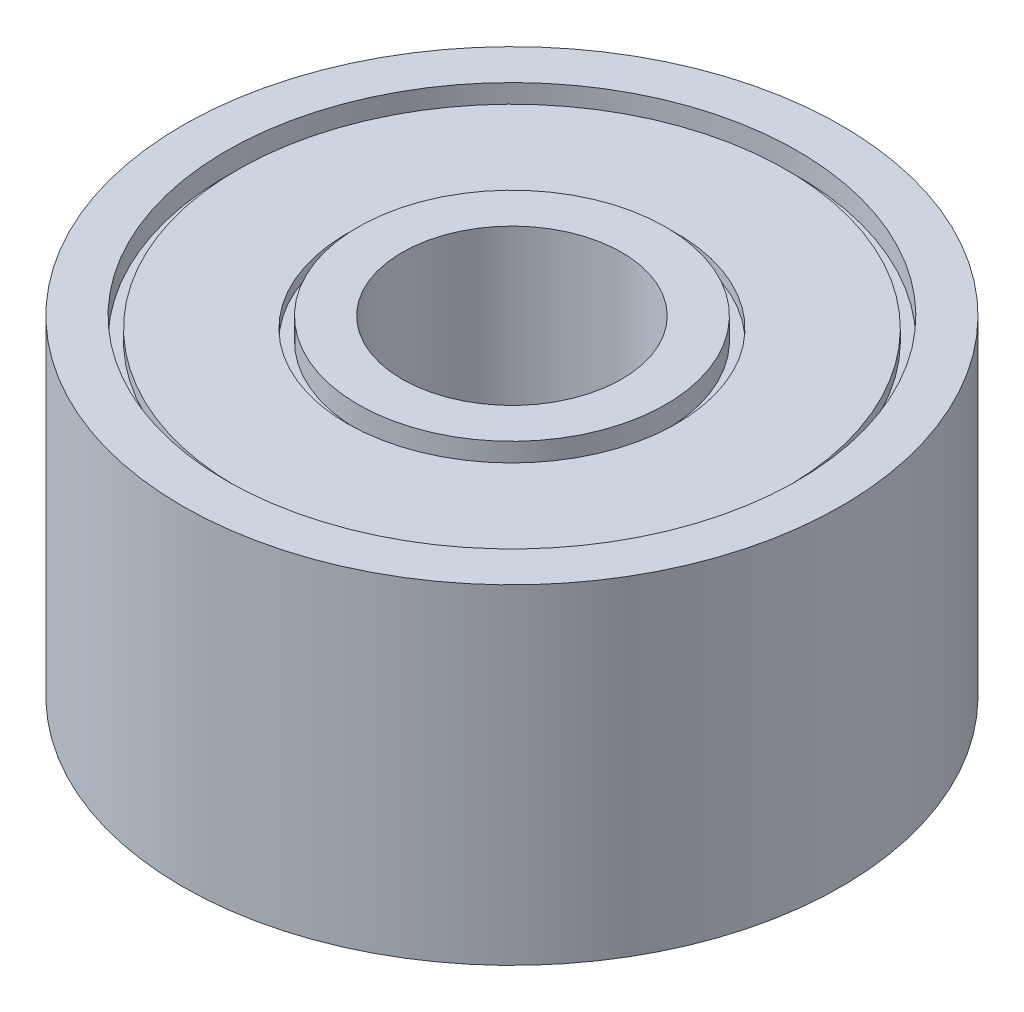
ISO-10303-21;
HEADER;
FILE_DESCRIPTION(('STEP AP214'),'2;1');
FILE_NAME('part.step','',(''),(''),'','','');
FILE_SCHEMA(('AUTOMOTIVE_DESIGN { 1 0 10303 214 1 1 1 1 }'));
ENDSEC;
DATA;
#1=APPLICATION_CONTEXT('core data for automotive mechanical design processes');
#2=APPLICATION_PROTOCOL_DEFINITION('international standard','automotive_design',2000,#1);
#3=PRODUCT_CONTEXT('',#1,'mechanical');
#4=PRODUCT('Part','Part','',(#3));
#5=PRODUCT_RELATED_PRODUCT_CATEGORY('part','',(#4));
#6=PRODUCT_DEFINITION_FORMATION('','',#4);
#7=PRODUCT_DEFINITION_CONTEXT('part definition',#1,'design');
#8=PRODUCT_DEFINITION('design','',#6,#7);
#9=PRODUCT_DEFINITION_SHAPE('','',#8);
#10=(LENGTH_UNIT() NAMED_UNIT(*) SI_UNIT(.MILLI.,.METRE.));
#11=(NAMED_UNIT(*) PLANE_ANGLE_UNIT() SI_UNIT($,.RADIAN.));
#12=(NAMED_UNIT(*) SI_UNIT($,.STERADIAN.) SOLID_ANGLE_UNIT());
#13=UNCERTAINTY_MEASURE_WITH_UNIT(LENGTH_MEASURE(1.E-05),#10,'distance_accuracy_value','');
#14=(GEOMETRIC_REPRESENTATION_CONTEXT(3) GLOBAL_UNCERTAINTY_ASSIGNED_CONTEXT((#13)) GLOBAL_UNIT_ASSIGNED_CONTEXT((#10,
#11,#12)) REPRESENTATION_CONTEXT('',''));
#15=CARTESIAN_POINT('',(0.,0.,0.));
#16=DIRECTION('',(0.,0.,1.));
#17=DIRECTION('',(1.,0.,0.));
#18=AXIS2_PLACEMENT_3D('',#15,#16,#17);
#19=CARTESIAN_POINT('',(0.,0.,0.));
#20=DIRECTION('',(0.,1.,0.));
#21=DIRECTION('',(0.,0.,1.));
#22=AXIS2_PLACEMENT_3D('',#19,#20,#21);
#23=CYLINDRICAL_SURFACE('',#22,3.);
#24=CARTESIAN_POINT('',(0.,-1.5,0.));
#25=DIRECTION('',(0.,1.,0.));
#26=DIRECTION('',(0.,0.,1.));
#27=AXIS2_PLACEMENT_3D('',#24,#25,#26);
#28=CIRCLE('',#27,3.);
#29=CARTESIAN_POINT('',(0.,-1.5,3.));
#30=VERTEX_POINT('',#29);
#31=EDGE_CURVE('E10',#30,#30,#28,.T.);
#32=ORIENTED_EDGE('',*,*,#31,.T.);
#33=EDGE_LOOP('',(#32));
#34=FACE_BOUND('',#33,.T.);
#35=CARTESIAN_POINT('',(0.,1.5,0.));
#36=DIRECTION('',(0.,1.,0.));
#37=DIRECTION('',(0.,0.,1.));
#38=AXIS2_PLACEMENT_3D('',#35,#36,#37);
#39=CIRCLE('',#38,3.);
#40=CARTESIAN_POINT('',(0.,1.5,3.));
#41=VERTEX_POINT('',#40);
#42=EDGE_CURVE('E72',#41,#41,#39,.T.);
#43=ORIENTED_EDGE('',*,*,#42,.F.);
#44=EDGE_LOOP('',(#43));
#45=FACE_BOUND('',#44,.T.);
#46=ADVANCED_FACE('F35',(#34,#45),#23,.T.);
#47=CARTESIAN_POINT('',(0.,-1.5,3.));
#48=DIRECTION('',(0.,-1.,0.));
#49=DIRECTION('',(0.,0.,-1.));
#50=AXIS2_PLACEMENT_3D('',#47,#48,#49);
#51=PLANE('',#50);
#52=CARTESIAN_POINT('',(0.,-1.5,0.));
#53=DIRECTION('',(0.,1.,0.));
#54=DIRECTION('',(0.,0.,1.));
#55=AXIS2_PLACEMENT_3D('',#52,#53,#54);
#56=CIRCLE('',#55,2.6);
#57=CARTESIAN_POINT('',(0.,-1.5,2.6));
#58=VERTEX_POINT('',#57);
#59=EDGE_CURVE('E41',#58,#58,#56,.T.);
#60=ORIENTED_EDGE('',*,*,#59,.T.);
#61=EDGE_LOOP('',(#60));
#62=FACE_BOUND('',#61,.T.);
#63=ORIENTED_EDGE('',*,*,#31,.F.);
#64=EDGE_LOOP('',(#63));
#65=FACE_BOUND('',#64,.T.);
#66=ADVANCED_FACE('F160',(#62,#65),#51,.T.);
#67=CARTESIAN_POINT('',(0.,0.,0.));
#68=DIRECTION('',(0.,1.,0.));
#69=DIRECTION('',(0.,0.,1.));
#70=AXIS2_PLACEMENT_3D('',#67,#68,#69);
#71=CYLINDRICAL_SURFACE('',#70,2.6);
#72=CARTESIAN_POINT('',(0.,-1.3,0.));
#73=DIRECTION('',(0.,1.,0.));
#74=DIRECTION('',(0.,0.,1.));
#75=AXIS2_PLACEMENT_3D('',#72,#73,#74);
#76=CIRCLE('',#75,2.6);
#77=CARTESIAN_POINT('',(0.,-1.3,2.6));
#78=VERTEX_POINT('',#77);
#79=EDGE_CURVE('E45',#78,#78,#76,.T.);
#80=ORIENTED_EDGE('',*,*,#79,.T.);
#81=EDGE_LOOP('',(#80));
#82=FACE_BOUND('',#81,.T.);
#83=ORIENTED_EDGE('',*,*,#59,.F.);
#84=EDGE_LOOP('',(#83));
#85=FACE_BOUND('',#84,.T.);
#86=ADVANCED_FACE('F166',(#82,#85),#71,.F.);
#87=CARTESIAN_POINT('',(0.,-1.3,2.6));
#88=DIRECTION('',(0.,-1.,0.));
#89=DIRECTION('',(0.,0.,-1.));
#90=AXIS2_PLACEMENT_3D('',#87,#88,#89);
#91=PLANE('',#90);
#92=CARTESIAN_POINT('',(0.,-1.3,0.));
#93=DIRECTION('',(0.,1.,0.));
#94=DIRECTION('',(0.,0.,1.));
#95=AXIS2_PLACEMENT_3D('',#92,#93,#94);
#96=CIRCLE('',#95,2.5);
#97=CARTESIAN_POINT('',(0.,-1.3,2.5));
#98=VERTEX_POINT('',#97);
#99=EDGE_CURVE('E49',#98,#98,#96,.T.);
#100=ORIENTED_EDGE('',*,*,#99,.T.);
#101=EDGE_LOOP('',(#100));
#102=FACE_BOUND('',#101,.T.);
#103=ORIENTED_EDGE('',*,*,#79,.F.);
#104=EDGE_LOOP('',(#103));
#105=FACE_BOUND('',#104,.T.);
#106=ADVANCED_FACE('F170',(#102,#105),#91,.T.);
#107=CARTESIAN_POINT('',(0.,0.,0.));
#108=DIRECTION('',(0.,1.,0.));
#109=DIRECTION('',(0.,0.,1.));
#110=AXIS2_PLACEMENT_3D('',#107,#108,#109);
#111=CYLINDRICAL_SURFACE('',#110,2.5);
#112=CARTESIAN_POINT('',(0.,-1.4,0.));
#113=DIRECTION('',(0.,1.,0.));
#114=DIRECTION('',(0.,0.,1.));
#115=AXIS2_PLACEMENT_3D('',#112,#113,#114);
#116=CIRCLE('',#115,2.5);
#117=CARTESIAN_POINT('',(0.,-1.4,2.5));
#118=VERTEX_POINT('',#117);
#119=EDGE_CURVE('E54',#118,#118,#116,.T.);
#120=ORIENTED_EDGE('',*,*,#119,.T.);
#121=EDGE_LOOP('',(#120));
#122=FACE_BOUND('',#121,.T.);
#123=ORIENTED_EDGE('',*,*,#99,.F.);
#124=EDGE_LOOP('',(#123));
#125=FACE_BOUND('',#124,.T.);
#126=ADVANCED_FACE('F177',(#122,#125),#111,.T.);
#127=CARTESIAN_POINT('',(0.,-1.4,2.5));
#128=DIRECTION('',(0.,-1.,0.));
#129=DIRECTION('',(0.,0.,-1.));
#130=AXIS2_PLACEMENT_3D('',#127,#128,#129);
#131=PLANE('',#130);
#132=CARTESIAN_POINT('',(0.,-1.4,0.));
#133=DIRECTION('',(0.,1.,0.));
#134=DIRECTION('',(0.,0.,1.));
#135=AXIS2_PLACEMENT_3D('',#132,#133,#134);
#136=CIRCLE('',#135,1.5);
#137=CARTESIAN_POINT('',(0.,-1.4,1.5));
#138=VERTEX_POINT('',#137);
#139=EDGE_CURVE('E57',#138,#138,#136,.T.);
#140=ORIENTED_EDGE('',*,*,#139,.T.);
#141=EDGE_LOOP('',(#140));
#142=FACE_BOUND('',#141,.T.);
#143=ORIENTED_EDGE('',*,*,#119,.F.);
#144=EDGE_LOOP('',(#143));
#145=FACE_BOUND('',#144,.T.);
#146=ADVANCED_FACE('F181',(#142,#145),#131,.T.);
#147=CARTESIAN_POINT('',(0.,0.,0.));
#148=DIRECTION('',(0.,1.,0.));
#149=DIRECTION('',(0.,0.,1.));
#150=AXIS2_PLACEMENT_3D('',#147,#148,#149);
#151=CYLINDRICAL_SURFACE('',#150,1.5);
#152=CARTESIAN_POINT('',(0.,-1.3,0.));
#153=DIRECTION('',(0.,1.,0.));
#154=DIRECTION('',(0.,0.,1.));
#155=AXIS2_PLACEMENT_3D('',#152,#153,#154);
#156=CIRCLE('',#155,1.5);
#157=CARTESIAN_POINT('',(0.,-1.3,1.5));
#158=VERTEX_POINT('',#157);
#159=EDGE_CURVE('E60',#158,#158,#156,.T.);
#160=ORIENTED_EDGE('',*,*,#159,.T.);
#161=EDGE_LOOP('',(#160));
#162=FACE_BOUND('',#161,.T.);
#163=ORIENTED_EDGE('',*,*,#139,.F.);
#164=EDGE_LOOP('',(#163));
#165=FACE_BOUND('',#164,.T.);
#166=ADVANCED_FACE('F185',(#162,#165),#151,.F.);
#167=CARTESIAN_POINT('',(0.,-1.3,1.5));
#168=DIRECTION('',(0.,-1.,0.));
#169=DIRECTION('',(0.,0.,-1.));
#170=AXIS2_PLACEMENT_3D('',#167,#168,#169);
#171=PLANE('',#170);
#172=CARTESIAN_POINT('',(0.,-1.3,0.));
#173=DIRECTION('',(0.,1.,0.));
#174=DIRECTION('',(0.,0.,1.));
#175=AXIS2_PLACEMENT_3D('',#172,#173,#174);
#176=CIRCLE('',#175,1.4);
#177=CARTESIAN_POINT('',(0.,-1.3,1.4));
#178=VERTEX_POINT('',#177);
#179=EDGE_CURVE('E63',#178,#178,#176,.T.);
#180=ORIENTED_EDGE('',*,*,#179,.T.);
#181=EDGE_LOOP('',(#180));
#182=FACE_BOUND('',#181,.T.);
#183=ORIENTED_EDGE('',*,*,#159,.F.);
#184=EDGE_LOOP('',(#183));
#185=FACE_BOUND('',#184,.T.);
#186=ADVANCED_FACE('F189',(#182,#185),#171,.T.);
#187=CARTESIAN_POINT('',(0.,0.,0.));
#188=DIRECTION('',(0.,1.,0.));
#189=DIRECTION('',(0.,0.,1.));
#190=AXIS2_PLACEMENT_3D('',#187,#188,#189);
#191=CYLINDRICAL_SURFACE('',#190,1.4);
#192=CARTESIAN_POINT('',(0.,-1.5,0.));
#193=DIRECTION('',(0.,1.,0.));
#194=DIRECTION('',(0.,0.,1.));
#195=AXIS2_PLACEMENT_3D('',#192,#193,#194);
#196=CIRCLE('',#195,1.4);
#197=CARTESIAN_POINT('',(0.,-1.5,1.4));
#198=VERTEX_POINT('',#197);
#199=EDGE_CURVE('E66',#198,#198,#196,.T.);
#200=ORIENTED_EDGE('',*,*,#199,.T.);
#201=EDGE_LOOP('',(#200));
#202=FACE_BOUND('',#201,.T.);
#203=ORIENTED_EDGE('',*,*,#179,.F.);
#204=EDGE_LOOP('',(#203));
#205=FACE_BOUND('',#204,.T.);
#206=ADVANCED_FACE('F193',(#202,#205),#191,.T.);
#207=CARTESIAN_POINT('',(0.,-1.5,1.4));
#208=DIRECTION('',(0.,-1.,0.));
#209=DIRECTION('',(0.,0.,-1.));
#210=AXIS2_PLACEMENT_3D('',#207,#208,#209);
#211=PLANE('',#210);
#212=CARTESIAN_POINT('',(0.,-1.5,0.));
#213=DIRECTION('',(0.,1.,0.));
#214=DIRECTION('',(0.,0.,1.));
#215=AXIS2_PLACEMENT_3D('',#212,#213,#214);
#216=CIRCLE('',#215,1.);
#217=CARTESIAN_POINT('',(0.,-1.5,1.));
#218=VERTEX_POINT('',#217);
#219=EDGE_CURVE('E69',#218,#218,#216,.T.);
#220=ORIENTED_EDGE('',*,*,#219,.T.);
#221=EDGE_LOOP('',(#220));
#222=FACE_BOUND('',#221,.T.);
#223=ORIENTED_EDGE('',*,*,#199,.F.);
#224=EDGE_LOOP('',(#223));
#225=FACE_BOUND('',#224,.T.);
#226=ADVANCED_FACE('F197',(#222,#225),#211,.T.);
#227=CARTESIAN_POINT('',(0.,0.,0.));
#228=DIRECTION('',(0.,1.,0.));
#229=DIRECTION('',(0.,0.,1.));
#230=AXIS2_PLACEMENT_3D('',#227,#228,#229);
#231=CYLINDRICAL_SURFACE('',#230,1.);
#232=ORIENTED_EDGE('',*,*,#219,.F.);
#233=EDGE_LOOP('',(#232));
#234=FACE_BOUND('',#233,.T.);
#235=CARTESIAN_POINT('',(0.,1.5,0.));
#236=DIRECTION('',(0.,1.,0.));
#237=DIRECTION('',(0.,0.,1.));
#238=AXIS2_PLACEMENT_3D('',#235,#236,#237);
#239=CIRCLE('',#238,1.);
#240=CARTESIAN_POINT('',(0.,1.5,1.));
#241=VERTEX_POINT('',#240);
#242=EDGE_CURVE('E99',#241,#241,#239,.T.);
#243=ORIENTED_EDGE('',*,*,#242,.T.);
#244=EDGE_LOOP('',(#243));
#245=FACE_BOUND('',#244,.T.);
#246=ADVANCED_FACE('F103',(#234,#245),#231,.F.);
#247=CARTESIAN_POINT('',(0.,1.5,3.));
#248=DIRECTION('',(0.,1.,0.));
#249=DIRECTION('',(0.,0.,-1.));
#250=AXIS2_PLACEMENT_3D('',#247,#248,#249);
#251=PLANE('',#250);
#252=CARTESIAN_POINT('',(0.,1.5,0.));
#253=DIRECTION('',(0.,1.,0.));
#254=DIRECTION('',(0.,0.,1.));
#255=AXIS2_PLACEMENT_3D('',#252,#253,#254);
#256=CIRCLE('',#255,2.6);
#257=CARTESIAN_POINT('',(0.,1.5,2.6));
#258=VERTEX_POINT('',#257);
#259=EDGE_CURVE('E75',#258,#258,#256,.T.);
#260=ORIENTED_EDGE('',*,*,#259,.F.);
#261=EDGE_LOOP('',(#260));
#262=FACE_BOUND('',#261,.T.);
#263=ORIENTED_EDGE('',*,*,#42,.T.);
#264=EDGE_LOOP('',(#263));
#265=FACE_BOUND('',#264,.T.);
#266=ADVANCED_FACE('F150',(#262,#265),#251,.T.);
#267=CARTESIAN_POINT('',(0.,0.,0.));
#268=DIRECTION('',(0.,-1.,0.));
#269=DIRECTION('',(0.,0.,1.));
#270=AXIS2_PLACEMENT_3D('',#267,#268,#269);
#271=CYLINDRICAL_SURFACE('',#270,2.6);
#272=CARTESIAN_POINT('',(0.,1.3,0.));
#273=DIRECTION('',(0.,1.,0.));
#274=DIRECTION('',(0.,0.,1.));
#275=AXIS2_PLACEMENT_3D('',#272,#273,#274);
#276=CIRCLE('',#275,2.6);
#277=CARTESIAN_POINT('',(0.,1.3,2.6));
#278=VERTEX_POINT('',#277);
#279=EDGE_CURVE('E78',#278,#278,#276,.T.);
#280=ORIENTED_EDGE('',*,*,#279,.F.);
#281=EDGE_LOOP('',(#280));
#282=FACE_BOUND('',#281,.T.);
#283=ORIENTED_EDGE('',*,*,#259,.T.);
#284=EDGE_LOOP('',(#283));
#285=FACE_BOUND('',#284,.T.);
#286=ADVANCED_FACE('F144',(#282,#285),#271,.F.);
#287=CARTESIAN_POINT('',(0.,1.3,2.6));
#288=DIRECTION('',(0.,1.,0.));
#289=DIRECTION('',(0.,0.,-1.));
#290=AXIS2_PLACEMENT_3D('',#287,#288,#289);
#291=PLANE('',#290);
#292=CARTESIAN_POINT('',(0.,1.3,0.));
#293=DIRECTION('',(0.,1.,0.));
#294=DIRECTION('',(0.,0.,1.));
#295=AXIS2_PLACEMENT_3D('',#292,#293,#294);
#296=CIRCLE('',#295,2.5);
#297=CARTESIAN_POINT('',(0.,1.3,2.5));
#298=VERTEX_POINT('',#297);
#299=EDGE_CURVE('E81',#298,#298,#296,.T.);
#300=ORIENTED_EDGE('',*,*,#299,.F.);
#301=EDGE_LOOP('',(#300));
#302=FACE_BOUND('',#301,.T.);
#303=ORIENTED_EDGE('',*,*,#279,.T.);
#304=EDGE_LOOP('',(#303));
#305=FACE_BOUND('',#304,.T.);
#306=ADVANCED_FACE('F138',(#302,#305),#291,.T.);
#307=CARTESIAN_POINT('',(0.,0.,0.));
#308=DIRECTION('',(0.,-1.,0.));
#309=DIRECTION('',(0.,0.,1.));
#310=AXIS2_PLACEMENT_3D('',#307,#308,#309);
#311=CYLINDRICAL_SURFACE('',#310,2.5);
#312=CARTESIAN_POINT('',(0.,1.4,0.));
#313=DIRECTION('',(0.,1.,0.));
#314=DIRECTION('',(0.,0.,1.));
#315=AXIS2_PLACEMENT_3D('',#312,#313,#314);
#316=CIRCLE('',#315,2.5);
#317=CARTESIAN_POINT('',(0.,1.4,2.5));
#318=VERTEX_POINT('',#317);
#319=EDGE_CURVE('E84',#318,#318,#316,.T.);
#320=ORIENTED_EDGE('',*,*,#319,.F.);
#321=EDGE_LOOP('',(#320));
#322=FACE_BOUND('',#321,.T.);
#323=ORIENTED_EDGE('',*,*,#299,.T.);
#324=EDGE_LOOP('',(#323));
#325=FACE_BOUND('',#324,.T.);
#326=ADVANCED_FACE('F132',(#322,#325),#311,.T.);
#327=CARTESIAN_POINT('',(0.,1.4,2.5));
#328=DIRECTION('',(0.,1.,0.));
#329=DIRECTION('',(0.,0.,-1.));
#330=AXIS2_PLACEMENT_3D('',#327,#328,#329);
#331=PLANE('',#330);
#332=CARTESIAN_POINT('',(0.,1.4,0.));
#333=DIRECTION('',(0.,1.,0.));
#334=DIRECTION('',(0.,0.,1.));
#335=AXIS2_PLACEMENT_3D('',#332,#333,#334);
#336=CIRCLE('',#335,1.5);
#337=CARTESIAN_POINT('',(0.,1.4,1.5));
#338=VERTEX_POINT('',#337);
#339=EDGE_CURVE('E87',#338,#338,#336,.T.);
#340=ORIENTED_EDGE('',*,*,#339,.F.);
#341=EDGE_LOOP('',(#340));
#342=FACE_BOUND('',#341,.T.);
#343=ORIENTED_EDGE('',*,*,#319,.T.);
#344=EDGE_LOOP('',(#343));
#345=FACE_BOUND('',#344,.T.);
#346=ADVANCED_FACE('F126',(#342,#345),#331,.T.);
#347=CARTESIAN_POINT('',(0.,0.,0.));
#348=DIRECTION('',(0.,-1.,0.));
#349=DIRECTION('',(0.,0.,1.));
#350=AXIS2_PLACEMENT_3D('',#347,#348,#349);
#351=CYLINDRICAL_SURFACE('',#350,1.5);
#352=CARTESIAN_POINT('',(0.,1.3,0.));
#353=DIRECTION('',(0.,1.,0.));
#354=DIRECTION('',(0.,0.,1.));
#355=AXIS2_PLACEMENT_3D('',#352,#353,#354);
#356=CIRCLE('',#355,1.5);
#357=CARTESIAN_POINT('',(0.,1.3,1.5));
#358=VERTEX_POINT('',#357);
#359=EDGE_CURVE('E90',#358,#358,#356,.T.);
#360=ORIENTED_EDGE('',*,*,#359,.F.);
#361=EDGE_LOOP('',(#360));
#362=FACE_BOUND('',#361,.T.);
#363=ORIENTED_EDGE('',*,*,#339,.T.);
#364=EDGE_LOOP('',(#363));
#365=FACE_BOUND('',#364,.T.);
#366=ADVANCED_FACE('F120',(#362,#365),#351,.F.);
#367=CARTESIAN_POINT('',(0.,1.3,1.5));
#368=DIRECTION('',(0.,1.,0.));
#369=DIRECTION('',(0.,0.,-1.));
#370=AXIS2_PLACEMENT_3D('',#367,#368,#369);
#371=PLANE('',#370);
#372=CARTESIAN_POINT('',(0.,1.3,0.));
#373=DIRECTION('',(0.,1.,0.));
#374=DIRECTION('',(0.,0.,1.));
#375=AXIS2_PLACEMENT_3D('',#372,#373,#374);
#376=CIRCLE('',#375,1.4);
#377=CARTESIAN_POINT('',(0.,1.3,1.4));
#378=VERTEX_POINT('',#377);
#379=EDGE_CURVE('E93',#378,#378,#376,.T.);
#380=ORIENTED_EDGE('',*,*,#379,.F.);
#381=EDGE_LOOP('',(#380));
#382=FACE_BOUND('',#381,.T.);
#383=ORIENTED_EDGE('',*,*,#359,.T.);
#384=EDGE_LOOP('',(#383));
#385=FACE_BOUND('',#384,.T.);
#386=ADVANCED_FACE('F114',(#382,#385),#371,.T.);
#387=CARTESIAN_POINT('',(0.,0.,0.));
#388=DIRECTION('',(0.,-1.,0.));
#389=DIRECTION('',(0.,0.,1.));
#390=AXIS2_PLACEMENT_3D('',#387,#388,#389);
#391=CYLINDRICAL_SURFACE('',#390,1.4);
#392=CARTESIAN_POINT('',(0.,1.5,0.));
#393=DIRECTION('',(0.,1.,0.));
#394=DIRECTION('',(0.,0.,1.));
#395=AXIS2_PLACEMENT_3D('',#392,#393,#394);
#396=CIRCLE('',#395,1.4);
#397=CARTESIAN_POINT('',(0.,1.5,1.4));
#398=VERTEX_POINT('',#397);
#399=EDGE_CURVE('E96',#398,#398,#396,.T.);
#400=ORIENTED_EDGE('',*,*,#399,.F.);
#401=EDGE_LOOP('',(#400));
#402=FACE_BOUND('',#401,.T.);
#403=ORIENTED_EDGE('',*,*,#379,.T.);
#404=EDGE_LOOP('',(#403));
#405=FACE_BOUND('',#404,.T.);
#406=ADVANCED_FACE('F108',(#402,#405),#391,.T.);
#407=CARTESIAN_POINT('',(0.,1.5,1.4));
#408=DIRECTION('',(0.,1.,0.));
#409=DIRECTION('',(0.,0.,-1.));
#410=AXIS2_PLACEMENT_3D('',#407,#408,#409);
#411=PLANE('',#410);
#412=ORIENTED_EDGE('',*,*,#242,.F.);
#413=EDGE_LOOP('',(#412));
#414=FACE_BOUND('',#413,.T.);
#415=ORIENTED_EDGE('',*,*,#399,.T.);
#416=EDGE_LOOP('',(#415));
#417=FACE_BOUND('',#416,.T.);
#418=ADVANCED_FACE('F105',(#414,#417),#411,.T.);
#419=CLOSED_SHELL('',(#46,#66,#86,#106,#126,#146,#166,#186,#206,#226,#246,#266,#286,#306,#326,
#346,#366,#386,#406,#418));
#420=MANIFOLD_SOLID_BREP('B2',#419);
#421=ADVANCED_BREP_SHAPE_REPRESENTATION('',(#18,#420),#14);
#422=SHAPE_DEFINITION_REPRESENTATION(#9,#421);
ENDSEC;
END-ISO-10303-21;
